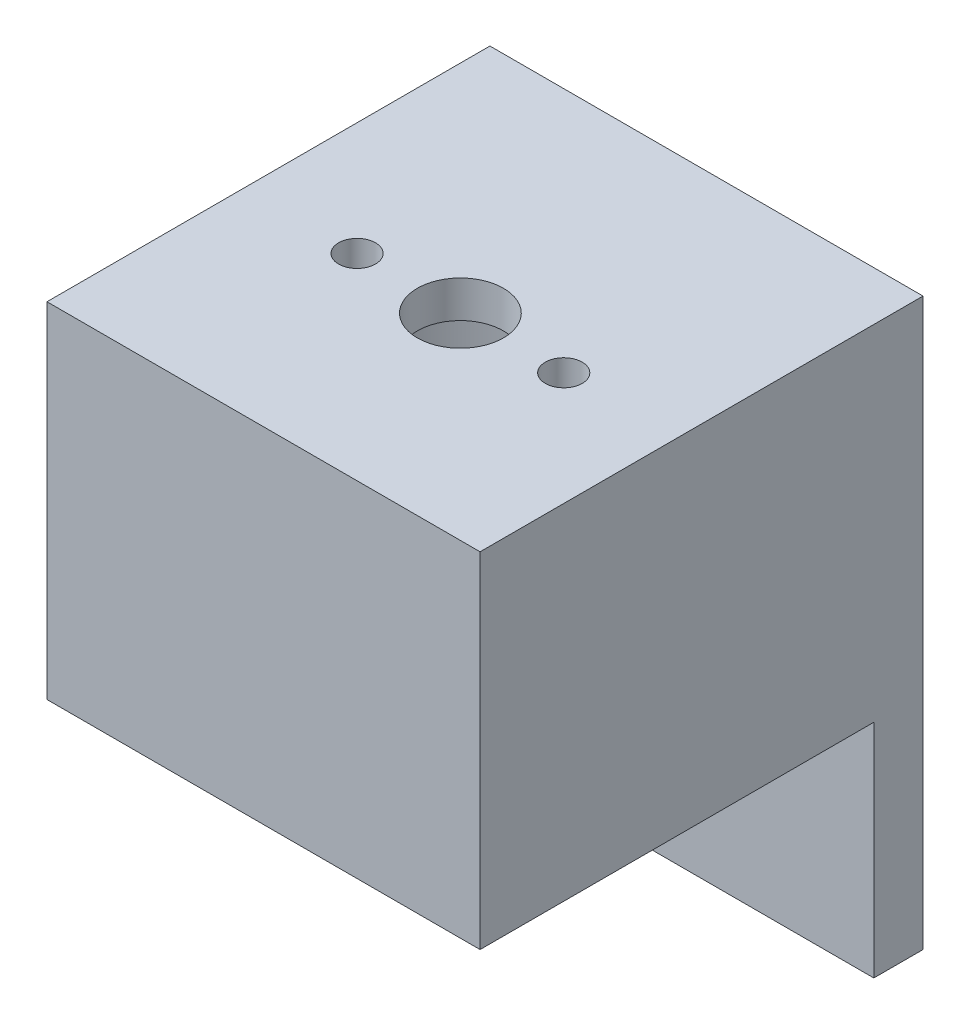
ISO-10303-21;
HEADER;
FILE_DESCRIPTION(('STEP AP214'),'2;1');
FILE_NAME('part.step','',(''),(''),'','','');
FILE_SCHEMA(('AUTOMOTIVE_DESIGN { 1 0 10303 214 1 1 1 1 }'));
ENDSEC;
DATA;
#1=APPLICATION_CONTEXT('core data for automotive mechanical design processes');
#2=APPLICATION_PROTOCOL_DEFINITION('international standard','automotive_design',2000,#1);
#3=PRODUCT_CONTEXT('',#1,'mechanical');
#4=PRODUCT('Part','Part','',(#3));
#5=PRODUCT_RELATED_PRODUCT_CATEGORY('part','',(#4));
#6=PRODUCT_DEFINITION_FORMATION('','',#4);
#7=PRODUCT_DEFINITION_CONTEXT('part definition',#1,'design');
#8=PRODUCT_DEFINITION('design','',#6,#7);
#9=PRODUCT_DEFINITION_SHAPE('','',#8);
#10=(LENGTH_UNIT() NAMED_UNIT(*) SI_UNIT(.MILLI.,.METRE.));
#11=(NAMED_UNIT(*) PLANE_ANGLE_UNIT() SI_UNIT($,.RADIAN.));
#12=(NAMED_UNIT(*) SI_UNIT($,.STERADIAN.) SOLID_ANGLE_UNIT());
#13=UNCERTAINTY_MEASURE_WITH_UNIT(LENGTH_MEASURE(1.E-05),#10,'distance_accuracy_value','');
#14=(GEOMETRIC_REPRESENTATION_CONTEXT(3) GLOBAL_UNCERTAINTY_ASSIGNED_CONTEXT((#13)) GLOBAL_UNIT_ASSIGNED_CONTEXT((#10,
#11,#12)) REPRESENTATION_CONTEXT('',''));
#15=CARTESIAN_POINT('',(0.,0.,0.));
#16=DIRECTION('',(0.,0.,1.));
#17=DIRECTION('',(1.,0.,0.));
#18=AXIS2_PLACEMENT_3D('',#15,#16,#17);
#19=CARTESIAN_POINT('',(0.,0.,4.));
#20=DIRECTION('',(0.,0.,-1.));
#21=DIRECTION('',(-1.,0.,0.));
#22=AXIS2_PLACEMENT_3D('',#19,#20,#21);
#23=PLANE('',#22);
#24=CARTESIAN_POINT('',(0.,-7.50000000000001,4.));
#25=DIRECTION('',(0.,0.,1.));
#26=DIRECTION('',(1.,0.,0.));
#27=AXIS2_PLACEMENT_3D('',#24,#25,#26);
#28=CIRCLE('',#27,2.);
#29=CARTESIAN_POINT('',(2.,-7.50000000000001,4.));
#30=VERTEX_POINT('',#29);
#31=EDGE_CURVE('E115',#30,#30,#28,.T.);
#32=ORIENTED_EDGE('',*,*,#31,.F.);
#33=EDGE_LOOP('',(#32));
#34=FACE_BOUND('',#33,.T.);
#35=CARTESIAN_POINT('',(0.,-17.5,4.));
#36=DIRECTION('',(0.,0.,1.));
#37=DIRECTION('',(1.,0.,0.));
#38=AXIS2_PLACEMENT_3D('',#35,#36,#37);
#39=CIRCLE('',#38,2.);
#40=CARTESIAN_POINT('',(2.,-17.5,4.));
#41=VERTEX_POINT('',#40);
#42=EDGE_CURVE('E123',#41,#41,#39,.T.);
#43=ORIENTED_EDGE('',*,*,#42,.F.);
#44=EDGE_LOOP('',(#43));
#45=FACE_BOUND('',#44,.T.);
#46=DIRECTION('',(1.,0.,0.));
#47=VECTOR('',#46,1.);
#48=CARTESIAN_POINT('',(-17.6,-3.50000000000001,4.));
#49=LINE('',#48,#47);
#50=CARTESIAN_POINT('',(-17.6,-3.50000000000001,4.));
#51=VERTEX_POINT('',#50);
#52=CARTESIAN_POINT('',(17.6,-3.50000000000001,4.));
#53=VERTEX_POINT('',#52);
#54=EDGE_CURVE('E58',#51,#53,#49,.T.);
#55=ORIENTED_EDGE('',*,*,#54,.F.);
#56=DIRECTION('',(0.,-1.,0.));
#57=VECTOR('',#56,1.);
#58=CARTESIAN_POINT('',(-17.6,-21.5,4.));
#59=LINE('',#58,#57);
#60=CARTESIAN_POINT('',(-17.6,-21.5,4.));
#61=VERTEX_POINT('',#60);
#62=EDGE_CURVE('E157',#51,#61,#59,.T.);
#63=ORIENTED_EDGE('',*,*,#62,.T.);
#64=DIRECTION('',(1.,0.,0.));
#65=VECTOR('',#64,1.);
#66=CARTESIAN_POINT('',(-17.6,-21.5,4.));
#67=LINE('',#66,#65);
#68=CARTESIAN_POINT('',(17.6,-21.5,4.));
#69=VERTEX_POINT('',#68);
#70=EDGE_CURVE('E64',#61,#69,#67,.T.);
#71=ORIENTED_EDGE('',*,*,#70,.T.);
#72=DIRECTION('',(0.,1.,0.));
#73=VECTOR('',#72,1.);
#74=CARTESIAN_POINT('',(17.6,-21.5,4.));
#75=LINE('',#74,#73);
#76=EDGE_CURVE('E85',#69,#53,#75,.T.);
#77=ORIENTED_EDGE('',*,*,#76,.T.);
#78=EDGE_LOOP('',(#55,#63,#71,#77));
#79=FACE_BOUND('',#78,.T.);
#80=ADVANCED_FACE('F40',(#34,#45,#79),#23,.F.);
#81=CARTESIAN_POINT('',(17.6,-21.5,4.));
#82=DIRECTION('',(-1.,0.,0.));
#83=DIRECTION('',(0.,0.,1.));
#84=AXIS2_PLACEMENT_3D('',#81,#82,#83);
#85=PLANE('',#84);
#86=DIRECTION('',(0.,1.,0.));
#87=VECTOR('',#86,1.);
#88=CARTESIAN_POINT('',(17.6,-21.5,0.));
#89=LINE('',#88,#87);
#90=CARTESIAN_POINT('',(17.6,-21.5,0.));
#91=VERTEX_POINT('',#90);
#92=CARTESIAN_POINT('',(17.6,24.5,0.));
#93=VERTEX_POINT('',#92);
#94=EDGE_CURVE('E92',#91,#93,#89,.T.);
#95=ORIENTED_EDGE('',*,*,#94,.T.);
#96=DIRECTION('',(0.,0.,-1.));
#97=VECTOR('',#96,1.);
#98=CARTESIAN_POINT('',(17.6,24.5,0.));
#99=LINE('',#98,#97);
#100=CARTESIAN_POINT('',(17.6,24.5,36.));
#101=VERTEX_POINT('',#100);
#102=EDGE_CURVE('E174',#101,#93,#99,.T.);
#103=ORIENTED_EDGE('',*,*,#102,.F.);
#104=DIRECTION('',(0.,1.,0.));
#105=VECTOR('',#104,1.);
#106=CARTESIAN_POINT('',(17.6,21.5,36.));
#107=LINE('',#106,#105);
#108=CARTESIAN_POINT('',(17.6,-3.50000000000001,36.));
#109=VERTEX_POINT('',#108);
#110=EDGE_CURVE('E148',#109,#101,#107,.T.);
#111=ORIENTED_EDGE('',*,*,#110,.F.);
#112=DIRECTION('',(0.,0.,-1.));
#113=VECTOR('',#112,1.);
#114=CARTESIAN_POINT('',(17.6,-3.50000000000001,36.));
#115=LINE('',#114,#113);
#116=EDGE_CURVE('E108',#109,#53,#115,.T.);
#117=ORIENTED_EDGE('',*,*,#116,.T.);
#118=ORIENTED_EDGE('',*,*,#76,.F.);
#119=DIRECTION('',(0.,0.,-1.));
#120=VECTOR('',#119,1.);
#121=CARTESIAN_POINT('',(17.6,-21.5,4.));
#122=LINE('',#121,#120);
#123=EDGE_CURVE('E50',#69,#91,#122,.T.);
#124=ORIENTED_EDGE('',*,*,#123,.T.);
#125=EDGE_LOOP('',(#95,#103,#111,#117,#118,#124));
#126=FACE_BOUND('',#125,.T.);
#127=ADVANCED_FACE('F42',(#126),#85,.F.);
#128=CARTESIAN_POINT('',(-17.6,-21.5,4.));
#129=DIRECTION('',(1.,0.,0.));
#130=DIRECTION('',(0.,0.,-1.));
#131=AXIS2_PLACEMENT_3D('',#128,#129,#130);
#132=PLANE('',#131);
#133=DIRECTION('',(0.,-1.,0.));
#134=VECTOR('',#133,1.);
#135=CARTESIAN_POINT('',(-17.6,-21.5,0.));
#136=LINE('',#135,#134);
#137=CARTESIAN_POINT('',(-17.6,24.5,0.));
#138=VERTEX_POINT('',#137);
#139=CARTESIAN_POINT('',(-17.6,-21.5,0.));
#140=VERTEX_POINT('',#139);
#141=EDGE_CURVE('E86',#138,#140,#136,.T.);
#142=ORIENTED_EDGE('',*,*,#141,.T.);
#143=DIRECTION('',(0.,0.,-1.));
#144=VECTOR('',#143,1.);
#145=CARTESIAN_POINT('',(-17.6,-21.5,4.));
#146=LINE('',#145,#144);
#147=EDGE_CURVE('E11',#61,#140,#146,.T.);
#148=ORIENTED_EDGE('',*,*,#147,.F.);
#149=ORIENTED_EDGE('',*,*,#62,.F.);
#150=DIRECTION('',(0.,0.,-1.));
#151=VECTOR('',#150,1.);
#152=CARTESIAN_POINT('',(-17.6,-3.50000000000001,36.));
#153=LINE('',#152,#151);
#154=CARTESIAN_POINT('',(-17.6,-3.50000000000001,36.));
#155=VERTEX_POINT('',#154);
#156=EDGE_CURVE('E102',#155,#51,#153,.T.);
#157=ORIENTED_EDGE('',*,*,#156,.F.);
#158=DIRECTION('',(0.,-1.,0.));
#159=VECTOR('',#158,1.);
#160=CARTESIAN_POINT('',(-17.6,21.5,36.));
#161=LINE('',#160,#159);
#162=CARTESIAN_POINT('',(-17.6,24.5,36.));
#163=VERTEX_POINT('',#162);
#164=EDGE_CURVE('E140',#163,#155,#161,.T.);
#165=ORIENTED_EDGE('',*,*,#164,.F.);
#166=DIRECTION('',(0.,0.,1.));
#167=VECTOR('',#166,1.);
#168=CARTESIAN_POINT('',(-17.6,24.5,0.));
#169=LINE('',#168,#167);
#170=EDGE_CURVE('E167',#138,#163,#169,.T.);
#171=ORIENTED_EDGE('',*,*,#170,.F.);
#172=EDGE_LOOP('',(#142,#148,#149,#157,#165,#171));
#173=FACE_BOUND('',#172,.T.);
#174=ADVANCED_FACE('F162',(#173),#132,.F.);
#175=CARTESIAN_POINT('',(-17.6,-21.5,4.));
#176=DIRECTION('',(0.,1.,0.));
#177=DIRECTION('',(0.,0.,1.));
#178=AXIS2_PLACEMENT_3D('',#175,#176,#177);
#179=PLANE('',#178);
#180=DIRECTION('',(1.,0.,0.));
#181=VECTOR('',#180,1.);
#182=CARTESIAN_POINT('',(-17.6,-21.5,0.));
#183=LINE('',#182,#181);
#184=EDGE_CURVE('E76',#140,#91,#183,.T.);
#185=ORIENTED_EDGE('',*,*,#184,.T.);
#186=ORIENTED_EDGE('',*,*,#123,.F.);
#187=ORIENTED_EDGE('',*,*,#70,.F.);
#188=ORIENTED_EDGE('',*,*,#147,.T.);
#189=EDGE_LOOP('',(#185,#186,#187,#188));
#190=FACE_BOUND('',#189,.T.);
#191=ADVANCED_FACE('F78',(#190),#179,.F.);
#192=CARTESIAN_POINT('',(0.,0.,0.));
#193=DIRECTION('',(0.,0.,-1.));
#194=DIRECTION('',(-1.,0.,0.));
#195=AXIS2_PLACEMENT_3D('',#192,#193,#194);
#196=PLANE('',#195);
#197=CARTESIAN_POINT('',(0.,-7.50000000000001,0.));
#198=DIRECTION('',(0.,0.,-1.));
#199=DIRECTION('',(-1.,0.,0.));
#200=AXIS2_PLACEMENT_3D('',#197,#198,#199);
#201=CIRCLE('',#200,2.);
#202=CARTESIAN_POINT('',(-2.,-7.50000000000001,0.));
#203=VERTEX_POINT('',#202);
#204=EDGE_CURVE('E44',#203,#203,#201,.T.);
#205=ORIENTED_EDGE('',*,*,#204,.F.);
#206=EDGE_LOOP('',(#205));
#207=FACE_BOUND('',#206,.T.);
#208=CARTESIAN_POINT('',(0.,-17.5,0.));
#209=DIRECTION('',(0.,0.,-1.));
#210=DIRECTION('',(-1.,0.,0.));
#211=AXIS2_PLACEMENT_3D('',#208,#209,#210);
#212=CIRCLE('',#211,2.);
#213=CARTESIAN_POINT('',(-2.,-17.5,0.));
#214=VERTEX_POINT('',#213);
#215=EDGE_CURVE('E112',#214,#214,#212,.T.);
#216=ORIENTED_EDGE('',*,*,#215,.F.);
#217=EDGE_LOOP('',(#216));
#218=FACE_BOUND('',#217,.T.);
#219=ORIENTED_EDGE('',*,*,#94,.F.);
#220=ORIENTED_EDGE('',*,*,#184,.F.);
#221=ORIENTED_EDGE('',*,*,#141,.F.);
#222=DIRECTION('',(-1.,0.,0.));
#223=VECTOR('',#222,1.);
#224=CARTESIAN_POINT('',(-17.6,24.5,0.));
#225=LINE('',#224,#223);
#226=EDGE_CURVE('E100',#93,#138,#225,.T.);
#227=ORIENTED_EDGE('',*,*,#226,.F.);
#228=EDGE_LOOP('',(#219,#220,#221,#227));
#229=FACE_BOUND('',#228,.T.);
#230=ADVANCED_FACE('F98',(#207,#218,#229),#196,.T.);
#231=CARTESIAN_POINT('',(-17.6,-3.50000000000001,36.));
#232=DIRECTION('',(0.,1.,0.));
#233=DIRECTION('',(0.,0.,1.));
#234=AXIS2_PLACEMENT_3D('',#231,#232,#233);
#235=PLANE('',#234);
#236=CARTESIAN_POINT('',(0.,-3.50000000000001,20.));
#237=DIRECTION('',(0.,-1.,0.));
#238=DIRECTION('',(0.,0.,-1.));
#239=AXIS2_PLACEMENT_3D('',#236,#237,#238);
#240=CIRCLE('',#239,12.5);
#241=CARTESIAN_POINT('',(0.,-3.50000000000001,7.5));
#242=VERTEX_POINT('',#241);
#243=EDGE_CURVE('E121',#242,#242,#240,.T.);
#244=ORIENTED_EDGE('',*,*,#243,.F.);
#245=EDGE_LOOP('',(#244));
#246=FACE_BOUND('',#245,.T.);
#247=ORIENTED_EDGE('',*,*,#54,.T.);
#248=ORIENTED_EDGE('',*,*,#116,.F.);
#249=DIRECTION('',(1.,0.,0.));
#250=VECTOR('',#249,1.);
#251=CARTESIAN_POINT('',(-17.6,-3.50000000000001,36.));
#252=LINE('',#251,#250);
#253=EDGE_CURVE('E144',#155,#109,#252,.T.);
#254=ORIENTED_EDGE('',*,*,#253,.F.);
#255=ORIENTED_EDGE('',*,*,#156,.T.);
#256=EDGE_LOOP('',(#247,#248,#254,#255));
#257=FACE_BOUND('',#256,.T.);
#258=ADVANCED_FACE('F243',(#246,#257),#235,.F.);
#259=CARTESIAN_POINT('',(0.,0.,36.));
#260=DIRECTION('',(0.,0.,1.));
#261=DIRECTION('',(1.,0.,0.));
#262=AXIS2_PLACEMENT_3D('',#259,#260,#261);
#263=PLANE('',#262);
#264=ORIENTED_EDGE('',*,*,#164,.T.);
#265=ORIENTED_EDGE('',*,*,#253,.T.);
#266=ORIENTED_EDGE('',*,*,#110,.T.);
#267=DIRECTION('',(1.,0.,0.));
#268=VECTOR('',#267,1.);
#269=CARTESIAN_POINT('',(-17.6,24.5,36.));
#270=LINE('',#269,#268);
#271=EDGE_CURVE('E177',#163,#101,#270,.T.);
#272=ORIENTED_EDGE('',*,*,#271,.F.);
#273=EDGE_LOOP('',(#264,#265,#266,#272));
#274=FACE_BOUND('',#273,.T.);
#275=ADVANCED_FACE('F234',(#274),#263,.T.);
#276=CARTESIAN_POINT('',(0.,28.5,20.));
#277=DIRECTION('',(0.,-1.,0.));
#278=DIRECTION('',(0.,0.,-1.));
#279=AXIS2_PLACEMENT_3D('',#276,#277,#278);
#280=CYLINDRICAL_SURFACE('',#279,12.5);
#281=ORIENTED_EDGE('',*,*,#243,.T.);
#282=EDGE_LOOP('',(#281));
#283=FACE_BOUND('',#282,.T.);
#284=CARTESIAN_POINT('',(0.,21.5,20.));
#285=DIRECTION('',(0.,-1.,0.));
#286=DIRECTION('',(0.,0.,-1.));
#287=AXIS2_PLACEMENT_3D('',#284,#285,#286);
#288=CIRCLE('',#287,12.5);
#289=CARTESIAN_POINT('',(0.,21.5,7.5));
#290=VERTEX_POINT('',#289);
#291=EDGE_CURVE('E136',#290,#290,#288,.T.);
#292=ORIENTED_EDGE('',*,*,#291,.F.);
#293=EDGE_LOOP('',(#292));
#294=FACE_BOUND('',#293,.T.);
#295=ADVANCED_FACE('F231',(#283,#294),#280,.F.);
#296=CARTESIAN_POINT('',(0.,-17.5,-28.));
#297=DIRECTION('',(0.,0.,1.));
#298=DIRECTION('',(1.,0.,0.));
#299=AXIS2_PLACEMENT_3D('',#296,#297,#298);
#300=CYLINDRICAL_SURFACE('',#299,2.);
#301=ORIENTED_EDGE('',*,*,#215,.T.);
#302=EDGE_LOOP('',(#301));
#303=FACE_BOUND('',#302,.T.);
#304=ORIENTED_EDGE('',*,*,#42,.T.);
#305=EDGE_LOOP('',(#304));
#306=FACE_BOUND('',#305,.T.);
#307=ADVANCED_FACE('F233',(#303,#306),#300,.F.);
#308=CARTESIAN_POINT('',(0.,-7.50000000000001,-28.));
#309=DIRECTION('',(0.,0.,1.));
#310=DIRECTION('',(1.,0.,0.));
#311=AXIS2_PLACEMENT_3D('',#308,#309,#310);
#312=CYLINDRICAL_SURFACE('',#311,2.);
#313=ORIENTED_EDGE('',*,*,#204,.T.);
#314=EDGE_LOOP('',(#313));
#315=FACE_BOUND('',#314,.T.);
#316=ORIENTED_EDGE('',*,*,#31,.T.);
#317=EDGE_LOOP('',(#316));
#318=FACE_BOUND('',#317,.T.);
#319=ADVANCED_FACE('F226',(#315,#318),#312,.F.);
#320=CARTESIAN_POINT('',(0.,21.5,0.));
#321=DIRECTION('',(0.,1.,0.));
#322=DIRECTION('',(0.,0.,1.));
#323=AXIS2_PLACEMENT_3D('',#320,#321,#322);
#324=PLANE('',#323);
#325=CARTESIAN_POINT('',(-8.40000000000001,21.5,20.));
#326=DIRECTION('',(0.,1.,0.));
#327=DIRECTION('',(0.,0.,1.));
#328=AXIS2_PLACEMENT_3D('',#325,#326,#327);
#329=CIRCLE('',#328,1.5);
#330=CARTESIAN_POINT('',(-8.40000000000001,21.5,21.5));
#331=VERTEX_POINT('',#330);
#332=EDGE_CURVE('E183',#331,#331,#329,.T.);
#333=ORIENTED_EDGE('',*,*,#332,.T.);
#334=EDGE_LOOP('',(#333));
#335=FACE_BOUND('',#334,.T.);
#336=CARTESIAN_POINT('',(8.4,21.5,20.));
#337=DIRECTION('',(0.,1.,0.));
#338=DIRECTION('',(0.,0.,1.));
#339=AXIS2_PLACEMENT_3D('',#336,#337,#338);
#340=CIRCLE('',#339,1.5);
#341=CARTESIAN_POINT('',(8.4,21.5,21.5));
#342=VERTEX_POINT('',#341);
#343=EDGE_CURVE('E187',#342,#342,#340,.T.);
#344=ORIENTED_EDGE('',*,*,#343,.T.);
#345=EDGE_LOOP('',(#344));
#346=FACE_BOUND('',#345,.T.);
#347=CARTESIAN_POINT('',(0.,21.5,20.));
#348=DIRECTION('',(0.,1.,0.));
#349=DIRECTION('',(0.,0.,1.));
#350=AXIS2_PLACEMENT_3D('',#347,#348,#349);
#351=CIRCLE('',#350,3.5);
#352=CARTESIAN_POINT('',(0.,21.5,23.5));
#353=VERTEX_POINT('',#352);
#354=EDGE_CURVE('E191',#353,#353,#351,.T.);
#355=ORIENTED_EDGE('',*,*,#354,.T.);
#356=EDGE_LOOP('',(#355));
#357=FACE_BOUND('',#356,.T.);
#358=ORIENTED_EDGE('',*,*,#291,.T.);
#359=EDGE_LOOP('',(#358));
#360=FACE_BOUND('',#359,.T.);
#361=ADVANCED_FACE('F214',(#335,#346,#357,#360),#324,.F.);
#362=CARTESIAN_POINT('',(0.,24.5,0.));
#363=DIRECTION('',(0.,1.,0.));
#364=DIRECTION('',(0.,0.,1.));
#365=AXIS2_PLACEMENT_3D('',#362,#363,#364);
#366=PLANE('',#365);
#367=CARTESIAN_POINT('',(-8.40000000000001,24.5,20.));
#368=DIRECTION('',(0.,1.,0.));
#369=DIRECTION('',(0.,0.,1.));
#370=AXIS2_PLACEMENT_3D('',#367,#368,#369);
#371=CIRCLE('',#370,1.5);
#372=CARTESIAN_POINT('',(-8.40000000000001,24.5,21.5));
#373=VERTEX_POINT('',#372);
#374=EDGE_CURVE('E200',#373,#373,#371,.T.);
#375=ORIENTED_EDGE('',*,*,#374,.F.);
#376=EDGE_LOOP('',(#375));
#377=FACE_BOUND('',#376,.T.);
#378=CARTESIAN_POINT('',(8.4,24.5,20.));
#379=DIRECTION('',(0.,1.,0.));
#380=DIRECTION('',(0.,0.,1.));
#381=AXIS2_PLACEMENT_3D('',#378,#379,#380);
#382=CIRCLE('',#381,1.5);
#383=CARTESIAN_POINT('',(8.4,24.5,21.5));
#384=VERTEX_POINT('',#383);
#385=EDGE_CURVE('E199',#384,#384,#382,.T.);
#386=ORIENTED_EDGE('',*,*,#385,.F.);
#387=EDGE_LOOP('',(#386));
#388=FACE_BOUND('',#387,.T.);
#389=CARTESIAN_POINT('',(0.,24.5,20.));
#390=DIRECTION('',(0.,1.,0.));
#391=DIRECTION('',(0.,0.,1.));
#392=AXIS2_PLACEMENT_3D('',#389,#390,#391);
#393=CIRCLE('',#392,3.5);
#394=CARTESIAN_POINT('',(0.,24.5,23.5));
#395=VERTEX_POINT('',#394);
#396=EDGE_CURVE('E195',#395,#395,#393,.T.);
#397=ORIENTED_EDGE('',*,*,#396,.F.);
#398=EDGE_LOOP('',(#397));
#399=FACE_BOUND('',#398,.T.);
#400=ORIENTED_EDGE('',*,*,#170,.T.);
#401=ORIENTED_EDGE('',*,*,#271,.T.);
#402=ORIENTED_EDGE('',*,*,#102,.T.);
#403=ORIENTED_EDGE('',*,*,#226,.T.);
#404=EDGE_LOOP('',(#400,#401,#402,#403));
#405=FACE_BOUND('',#404,.T.);
#406=ADVANCED_FACE('F171',(#377,#388,#399,#405),#366,.T.);
#407=CARTESIAN_POINT('',(0.,14.5,20.));
#408=DIRECTION('',(0.,1.,0.));
#409=DIRECTION('',(0.,0.,1.));
#410=AXIS2_PLACEMENT_3D('',#407,#408,#409);
#411=CYLINDRICAL_SURFACE('',#410,3.5);
#412=ORIENTED_EDGE('',*,*,#396,.T.);
#413=EDGE_LOOP('',(#412));
#414=FACE_BOUND('',#413,.T.);
#415=ORIENTED_EDGE('',*,*,#354,.F.);
#416=EDGE_LOOP('',(#415));
#417=FACE_BOUND('',#416,.T.);
#418=ADVANCED_FACE('F213',(#414,#417),#411,.F.);
#419=CARTESIAN_POINT('',(8.4,14.5,20.));
#420=DIRECTION('',(0.,1.,0.));
#421=DIRECTION('',(0.,0.,1.));
#422=AXIS2_PLACEMENT_3D('',#419,#420,#421);
#423=CYLINDRICAL_SURFACE('',#422,1.5);
#424=ORIENTED_EDGE('',*,*,#385,.T.);
#425=EDGE_LOOP('',(#424));
#426=FACE_BOUND('',#425,.T.);
#427=ORIENTED_EDGE('',*,*,#343,.F.);
#428=EDGE_LOOP('',(#427));
#429=FACE_BOUND('',#428,.T.);
#430=ADVANCED_FACE('F208',(#426,#429),#423,.F.);
#431=CARTESIAN_POINT('',(-8.40000000000001,14.5,20.));
#432=DIRECTION('',(0.,1.,0.));
#433=DIRECTION('',(0.,0.,1.));
#434=AXIS2_PLACEMENT_3D('',#431,#432,#433);
#435=CYLINDRICAL_SURFACE('',#434,1.5);
#436=ORIENTED_EDGE('',*,*,#374,.T.);
#437=EDGE_LOOP('',(#436));
#438=FACE_BOUND('',#437,.T.);
#439=ORIENTED_EDGE('',*,*,#332,.F.);
#440=EDGE_LOOP('',(#439));
#441=FACE_BOUND('',#440,.T.);
#442=ADVANCED_FACE('F295',(#438,#441),#435,.F.);
#443=CLOSED_SHELL('',(#80,#127,#174,#191,#230,#258,#275,#295,#307,#319,#361,#406,#418,#430,#442));
#444=MANIFOLD_SOLID_BREP('B2',#443);
#445=ADVANCED_BREP_SHAPE_REPRESENTATION('',(#18,#444),#14);
#446=SHAPE_DEFINITION_REPRESENTATION(#9,#445);
ENDSEC;
END-ISO-10303-21;
